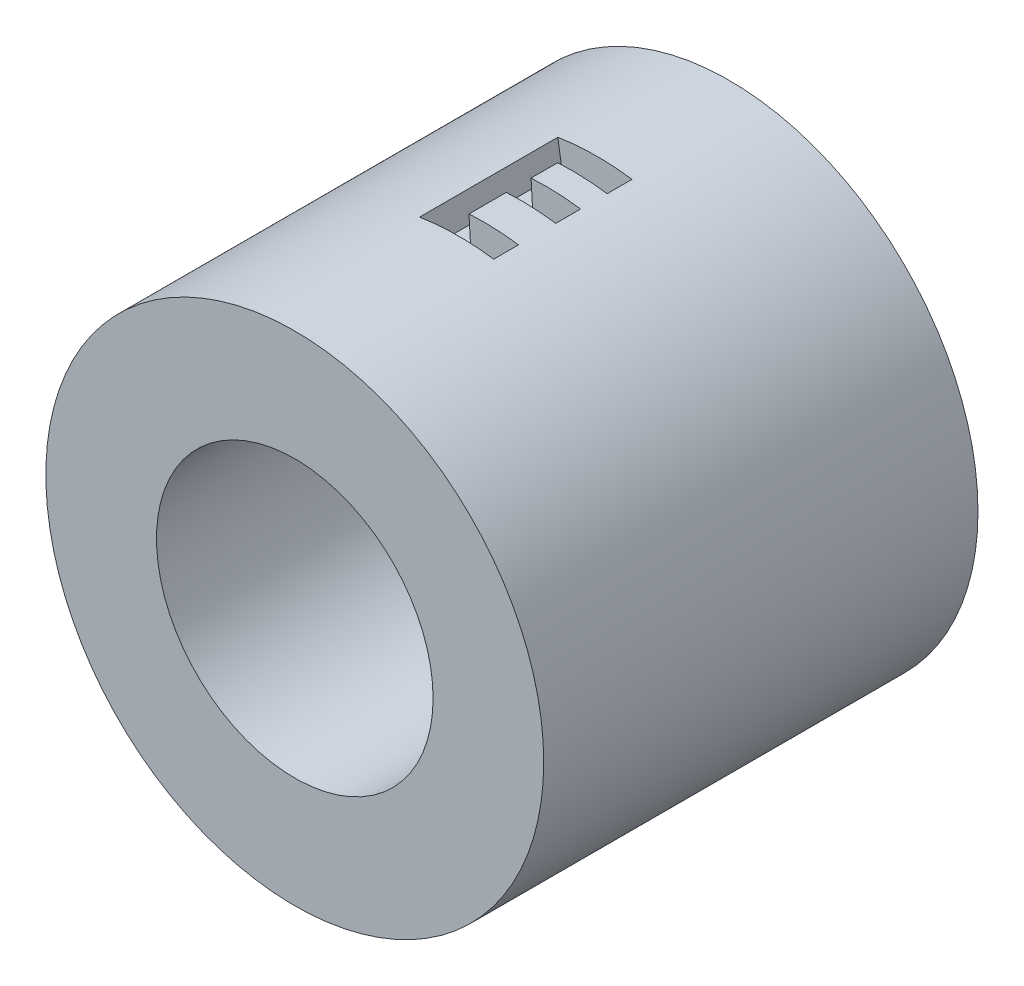
ISO-10303-21;
HEADER;
FILE_DESCRIPTION(('STEP AP214'),'2;1');
FILE_NAME('part.step','',(''),(''),'','','');
FILE_SCHEMA(('AUTOMOTIVE_DESIGN { 1 0 10303 214 1 1 1 1 }'));
ENDSEC;
DATA;
#1=APPLICATION_CONTEXT('core data for automotive mechanical design processes');
#2=APPLICATION_PROTOCOL_DEFINITION('international standard','automotive_design',2000,#1);
#3=PRODUCT_CONTEXT('',#1,'mechanical');
#4=PRODUCT('Part','Part','',(#3));
#5=PRODUCT_RELATED_PRODUCT_CATEGORY('part','',(#4));
#6=PRODUCT_DEFINITION_FORMATION('','',#4);
#7=PRODUCT_DEFINITION_CONTEXT('part definition',#1,'design');
#8=PRODUCT_DEFINITION('design','',#6,#7);
#9=PRODUCT_DEFINITION_SHAPE('','',#8);
#10=(LENGTH_UNIT() NAMED_UNIT(*) SI_UNIT(.MILLI.,.METRE.));
#11=(NAMED_UNIT(*) PLANE_ANGLE_UNIT() SI_UNIT($,.RADIAN.));
#12=(NAMED_UNIT(*) SI_UNIT($,.STERADIAN.) SOLID_ANGLE_UNIT());
#13=UNCERTAINTY_MEASURE_WITH_UNIT(LENGTH_MEASURE(1.E-05),#10,'distance_accuracy_value','');
#14=(GEOMETRIC_REPRESENTATION_CONTEXT(3) GLOBAL_UNCERTAINTY_ASSIGNED_CONTEXT((#13)) GLOBAL_UNIT_ASSIGNED_CONTEXT((#10,
#11,#12)) REPRESENTATION_CONTEXT('',''));
#15=CARTESIAN_POINT('',(0.,0.,0.));
#16=DIRECTION('',(0.,0.,1.));
#17=DIRECTION('',(1.,0.,0.));
#18=AXIS2_PLACEMENT_3D('',#15,#16,#17);
#19=CARTESIAN_POINT('',(0.,0.,19.939));
#20=DIRECTION('',(0.,0.,1.));
#21=DIRECTION('',(1.,0.,0.));
#22=AXIS2_PLACEMENT_3D('',#19,#20,#21);
#23=PLANE('',#22);
#24=CARTESIAN_POINT('',(0.,0.,19.939));
#25=DIRECTION('',(0.,0.,1.));
#26=DIRECTION('',(1.,0.,0.));
#27=AXIS2_PLACEMENT_3D('',#24,#25,#26);
#28=CIRCLE('',#27,11.43);
#29=CARTESIAN_POINT('',(11.43,0.,19.939));
#30=VERTEX_POINT('',#29);
#31=EDGE_CURVE('E13',#30,#30,#28,.T.);
#32=ORIENTED_EDGE('',*,*,#31,.T.);
#33=EDGE_LOOP('',(#32));
#34=FACE_BOUND('',#33,.T.);
#35=CARTESIAN_POINT('',(0.,0.,19.939));
#36=DIRECTION('',(0.,0.,1.));
#37=DIRECTION('',(1.,0.,0.));
#38=AXIS2_PLACEMENT_3D('',#35,#36,#37);
#39=CIRCLE('',#38,6.35);
#40=CARTESIAN_POINT('',(6.35,0.,19.939));
#41=VERTEX_POINT('',#40);
#42=EDGE_CURVE('E278',#41,#41,#39,.T.);
#43=ORIENTED_EDGE('',*,*,#42,.F.);
#44=EDGE_LOOP('',(#43));
#45=FACE_BOUND('',#44,.T.);
#46=ADVANCED_FACE('F85',(#34,#45),#23,.T.);
#47=CARTESIAN_POINT('',(0.,0.,0.));
#48=DIRECTION('',(0.,0.,1.));
#49=DIRECTION('',(1.,0.,0.));
#50=AXIS2_PLACEMENT_3D('',#47,#48,#49);
#51=PLANE('',#50);
#52=CARTESIAN_POINT('',(0.,0.,0.));
#53=DIRECTION('',(0.,0.,1.));
#54=DIRECTION('',(1.,0.,0.));
#55=AXIS2_PLACEMENT_3D('',#52,#53,#54);
#56=CIRCLE('',#55,11.43);
#57=CARTESIAN_POINT('',(11.43,0.,0.));
#58=VERTEX_POINT('',#57);
#59=EDGE_CURVE('E89',#58,#58,#56,.T.);
#60=ORIENTED_EDGE('',*,*,#59,.F.);
#61=EDGE_LOOP('',(#60));
#62=FACE_BOUND('',#61,.T.);
#63=CARTESIAN_POINT('',(0.,0.,0.));
#64=DIRECTION('',(0.,0.,1.));
#65=DIRECTION('',(1.,0.,0.));
#66=AXIS2_PLACEMENT_3D('',#63,#64,#65);
#67=CIRCLE('',#66,6.35);
#68=CARTESIAN_POINT('',(6.35,0.,0.));
#69=VERTEX_POINT('',#68);
#70=EDGE_CURVE('E275',#69,#69,#67,.T.);
#71=ORIENTED_EDGE('',*,*,#70,.T.);
#72=EDGE_LOOP('',(#71));
#73=FACE_BOUND('',#72,.T.);
#74=ADVANCED_FACE('F284',(#62,#73),#51,.F.);
#75=CARTESIAN_POINT('',(0.,0.,19.939));
#76=DIRECTION('',(0.,0.,-1.));
#77=DIRECTION('',(-1.,0.,0.));
#78=AXIS2_PLACEMENT_3D('',#75,#76,#77);
#79=CYLINDRICAL_SURFACE('',#78,11.43);
#80=CARTESIAN_POINT('',(0.,0.,6.05636615340659));
#81=DIRECTION('',(0.,0.,-1.));
#82=DIRECTION('',(0.140015636025612,0.990149292616191,0.));
#83=AXIS2_PLACEMENT_3D('',#80,#81,#82);
#84=CIRCLE('',#83,11.43);
#85=CARTESIAN_POINT('',(-1.80597624031449,11.2864232518287,6.05636615340659));
#86=VERTEX_POINT('',#85);
#87=CARTESIAN_POINT('',(1.60037871977274,11.3174064146031,6.05636615340659));
#88=VERTEX_POINT('',#87);
#89=EDGE_CURVE('E250',#86,#88,#84,.T.);
#90=ORIENTED_EDGE('',*,*,#89,.T.);
#91=DIRECTION('',(0.,0.,1.));
#92=VECTOR('',#91,1.);
#93=CARTESIAN_POINT('',(1.60037871977274,11.3174064146031,6.05636615340659));
#94=LINE('',#93,#92);
#95=CARTESIAN_POINT('',(1.60037871977274,11.3174064146031,7.19610974315018));
#96=VERTEX_POINT('',#95);
#97=EDGE_CURVE('E100',#88,#96,#94,.T.);
#98=ORIENTED_EDGE('',*,*,#97,.T.);
#99=CARTESIAN_POINT('',(0.,0.,7.19610974315018));
#100=DIRECTION('',(0.,0.,-1.));
#101=DIRECTION('',(0.140015636025612,0.990149292616191,0.));
#102=AXIS2_PLACEMENT_3D('',#99,#100,#101);
#103=CIRCLE('',#102,11.43);
#104=CARTESIAN_POINT('',(-0.673442466981699,11.410143524236,7.19610974315018));
#105=VERTEX_POINT('',#104);
#106=EDGE_CURVE('E186',#105,#96,#103,.T.);
#107=ORIENTED_EDGE('',*,*,#106,.F.);
#108=DIRECTION('',(0.,0.,1.));
#109=VECTOR('',#108,1.);
#110=CARTESIAN_POINT('',(-0.673442466981699,11.410143524236,7.19610974315018));
#111=LINE('',#110,#109);
#112=CARTESIAN_POINT('',(-0.673442466981701,11.410143524236,8.41726358930402));
#113=VERTEX_POINT('',#112);
#114=EDGE_CURVE('E242',#105,#113,#111,.T.);
#115=ORIENTED_EDGE('',*,*,#114,.T.);
#116=CARTESIAN_POINT('',(0.,0.,8.41726358930402));
#117=DIRECTION('',(0.,0.,-1.));
#118=DIRECTION('',(0.140015636025611,0.990149292616191,0.));
#119=AXIS2_PLACEMENT_3D('',#116,#117,#118);
#120=CIRCLE('',#119,11.43);
#121=CARTESIAN_POINT('',(1.60037871977274,11.3174064146031,8.41726358930402));
#122=VERTEX_POINT('',#121);
#123=EDGE_CURVE('E238',#113,#122,#120,.T.);
#124=ORIENTED_EDGE('',*,*,#123,.T.);
#125=DIRECTION('',(0.,0.,1.));
#126=VECTOR('',#125,1.);
#127=CARTESIAN_POINT('',(1.60037871977274,11.3174064146031,8.41726358930402));
#128=LINE('',#127,#126);
#129=CARTESIAN_POINT('',(1.60037871977274,11.3174064146031,9.55700717904761));
#130=VERTEX_POINT('',#129);
#131=EDGE_CURVE('E234',#122,#130,#128,.T.);
#132=ORIENTED_EDGE('',*,*,#131,.T.);
#133=CARTESIAN_POINT('',(0.,0.,9.55700717904761));
#134=DIRECTION('',(0.,0.,-1.));
#135=DIRECTION('',(0.140015636025612,0.990149292616191,0.));
#136=AXIS2_PLACEMENT_3D('',#133,#134,#135);
#137=CIRCLE('',#136,11.43);
#138=CARTESIAN_POINT('',(-0.673442466981699,11.410143524236,9.55700717904761));
#139=VERTEX_POINT('',#138);
#140=EDGE_CURVE('E230',#139,#130,#137,.T.);
#141=ORIENTED_EDGE('',*,*,#140,.F.);
#142=DIRECTION('',(0.,0.,1.));
#143=VECTOR('',#142,1.);
#144=CARTESIAN_POINT('',(-0.673442466981699,11.410143524236,9.55700717904761));
#145=LINE('',#144,#143);
#146=CARTESIAN_POINT('',(-0.673442466981701,11.410143524236,11.266622563663));
#147=VERTEX_POINT('',#146);
#148=EDGE_CURVE('E226',#139,#147,#145,.T.);
#149=ORIENTED_EDGE('',*,*,#148,.T.);
#150=CARTESIAN_POINT('',(0.,0.,11.266622563663));
#151=DIRECTION('',(0.,0.,-1.));
#152=DIRECTION('',(0.140015636025611,0.990149292616191,0.));
#153=AXIS2_PLACEMENT_3D('',#150,#151,#152);
#154=CIRCLE('',#153,11.43);
#155=CARTESIAN_POINT('',(1.60037871977274,11.3174064146031,11.266622563663));
#156=VERTEX_POINT('',#155);
#157=EDGE_CURVE('E222',#147,#156,#154,.T.);
#158=ORIENTED_EDGE('',*,*,#157,.T.);
#159=DIRECTION('',(0.,0.,1.));
#160=VECTOR('',#159,1.);
#161=CARTESIAN_POINT('',(1.60037871977274,11.3174064146031,11.266622563663));
#162=LINE('',#161,#160);
#163=CARTESIAN_POINT('',(1.60037871977274,11.3174064146031,12.4063661534066));
#164=VERTEX_POINT('',#163);
#165=EDGE_CURVE('E218',#156,#164,#162,.T.);
#166=ORIENTED_EDGE('',*,*,#165,.T.);
#167=CARTESIAN_POINT('',(0.,0.,12.4063661534066));
#168=DIRECTION('',(0.,0.,-1.));
#169=DIRECTION('',(0.140015636025612,0.990149292616191,0.));
#170=AXIS2_PLACEMENT_3D('',#167,#168,#169);
#171=CIRCLE('',#170,11.43);
#172=CARTESIAN_POINT('',(-1.80597624031449,11.2864232518287,12.4063661534066));
#173=VERTEX_POINT('',#172);
#174=EDGE_CURVE('E214',#173,#164,#171,.T.);
#175=ORIENTED_EDGE('',*,*,#174,.F.);
#176=DIRECTION('',(0.,0.,-1.));
#177=VECTOR('',#176,1.);
#178=CARTESIAN_POINT('',(-1.80597624031449,11.2864232518287,12.4063661534066));
#179=LINE('',#178,#177);
#180=EDGE_CURVE('E254',#173,#86,#179,.T.);
#181=ORIENTED_EDGE('',*,*,#180,.T.);
#182=EDGE_LOOP('',(#90,#98,#107,#115,#124,#132,#141,#149,#158,#166,#175,#181));
#183=FACE_BOUND('',#182,.T.);
#184=ORIENTED_EDGE('',*,*,#31,.F.);
#185=EDGE_LOOP('',(#184));
#186=FACE_BOUND('',#185,.T.);
#187=ORIENTED_EDGE('',*,*,#59,.T.);
#188=EDGE_LOOP('',(#187));
#189=FACE_BOUND('',#188,.T.);
#190=ADVANCED_FACE('F87',(#183,#186,#189),#79,.T.);
#191=CARTESIAN_POINT('',(0.,0.,19.939));
#192=DIRECTION('',(0.,0.,-1.));
#193=DIRECTION('',(-1.,0.,0.));
#194=AXIS2_PLACEMENT_3D('',#191,#192,#193);
#195=CYLINDRICAL_SURFACE('',#194,6.35);
#196=ORIENTED_EDGE('',*,*,#42,.T.);
#197=EDGE_LOOP('',(#196));
#198=FACE_BOUND('',#197,.T.);
#199=ORIENTED_EDGE('',*,*,#70,.F.);
#200=EDGE_LOOP('',(#199));
#201=FACE_BOUND('',#200,.T.);
#202=ADVANCED_FACE('F286',(#198,#201),#195,.F.);
#203=CARTESIAN_POINT('',(1.60037871977274,11.3174064146031,6.62623794827838));
#204=DIRECTION('',(-0.990149292616191,0.140015636025612,0.));
#205=DIRECTION('',(0.,0.,1.));
#206=AXIS2_PLACEMENT_3D('',#203,#204,#205);
#207=PLANE('',#206);
#208=DIRECTION('',(-0.140015636025612,-0.990149292616191,0.));
#209=VECTOR('',#208,1.);
#210=CARTESIAN_POINT('',(1.60037871977274,11.3174064146031,6.05636615340659));
#211=LINE('',#210,#209);
#212=CARTESIAN_POINT('',(1.42255886202022,10.0599168129805,6.05636615340659));
#213=VERTEX_POINT('',#212);
#214=EDGE_CURVE('E187',#88,#213,#211,.T.);
#215=ORIENTED_EDGE('',*,*,#214,.T.);
#216=DIRECTION('',(0.,0.,-1.));
#217=VECTOR('',#216,1.);
#218=CARTESIAN_POINT('',(1.42255886202022,10.0599168129805,19.939));
#219=LINE('',#218,#217);
#220=CARTESIAN_POINT('',(1.42255886202022,10.0599168129805,7.19610974315018));
#221=VERTEX_POINT('',#220);
#222=EDGE_CURVE('E191',#213,#221,#219,.F.);
#223=ORIENTED_EDGE('',*,*,#222,.T.);
#224=DIRECTION('',(-0.140015636025612,-0.990149292616191,0.));
#225=VECTOR('',#224,1.);
#226=CARTESIAN_POINT('',(1.60037871977274,11.3174064146031,7.19610974315018));
#227=LINE('',#226,#225);
#228=EDGE_CURVE('E179',#96,#221,#227,.T.);
#229=ORIENTED_EDGE('',*,*,#228,.F.);
#230=ORIENTED_EDGE('',*,*,#97,.F.);
#231=EDGE_LOOP('',(#215,#223,#229,#230));
#232=FACE_BOUND('',#231,.T.);
#233=ADVANCED_FACE('F192',(#232),#207,.T.);
#234=CARTESIAN_POINT('',(0.,0.,7.19610974315018));
#235=DIRECTION('',(0.,0.,1.));
#236=DIRECTION('',(1.,0.,0.));
#237=AXIS2_PLACEMENT_3D('',#234,#235,#236);
#238=PLANE('',#237);
#239=ORIENTED_EDGE('',*,*,#228,.T.);
#240=CARTESIAN_POINT('',(0.,0.,7.19610974315018));
#241=DIRECTION('',(0.,0.,-1.));
#242=DIRECTION('',(-1.,0.,0.));
#243=AXIS2_PLACEMENT_3D('',#240,#241,#242);
#244=CIRCLE('',#243,10.16);
#245=CARTESIAN_POINT('',(-0.598615526205954,10.1423497993209,7.19610974315018));
#246=VERTEX_POINT('',#245);
#247=EDGE_CURVE('E183',#246,#221,#244,.T.);
#248=ORIENTED_EDGE('',*,*,#247,.F.);
#249=DIRECTION('',(0.0589188510045231,-0.998262775523713,0.));
#250=VECTOR('',#249,1.);
#251=CARTESIAN_POINT('',(-0.673442466981699,11.410143524236,7.19610974315018));
#252=LINE('',#251,#250);
#253=EDGE_CURVE('E188',#105,#246,#252,.T.);
#254=ORIENTED_EDGE('',*,*,#253,.F.);
#255=ORIENTED_EDGE('',*,*,#106,.T.);
#256=EDGE_LOOP('',(#239,#248,#254,#255));
#257=FACE_BOUND('',#256,.T.);
#258=ADVANCED_FACE('F181',(#257),#238,.F.);
#259=CARTESIAN_POINT('',(-0.673442466981699,11.410143524236,7.8066866662271));
#260=DIRECTION('',(-0.998262775523713,-0.0589188510045231,0.));
#261=DIRECTION('',(0.,0.,1.));
#262=AXIS2_PLACEMENT_3D('',#259,#260,#261);
#263=PLANE('',#262);
#264=ORIENTED_EDGE('',*,*,#253,.T.);
#265=DIRECTION('',(0.,0.,-1.));
#266=VECTOR('',#265,1.);
#267=CARTESIAN_POINT('',(-0.598615526205954,10.1423497993209,19.939));
#268=LINE('',#267,#266);
#269=CARTESIAN_POINT('',(-0.598615526205954,10.1423497993209,8.41726358930402));
#270=VERTEX_POINT('',#269);
#271=EDGE_CURVE('E201',#246,#270,#268,.F.);
#272=ORIENTED_EDGE('',*,*,#271,.T.);
#273=DIRECTION('',(0.0589188510045233,-0.998262775523713,0.));
#274=VECTOR('',#273,1.);
#275=CARTESIAN_POINT('',(-0.673442466981701,11.410143524236,8.41726358930402));
#276=LINE('',#275,#274);
#277=EDGE_CURVE('E271',#113,#270,#276,.T.);
#278=ORIENTED_EDGE('',*,*,#277,.F.);
#279=ORIENTED_EDGE('',*,*,#114,.F.);
#280=EDGE_LOOP('',(#264,#272,#278,#279));
#281=FACE_BOUND('',#280,.T.);
#282=ADVANCED_FACE('F334',(#281),#263,.T.);
#283=CARTESIAN_POINT('',(0.,0.,8.41726358930402));
#284=DIRECTION('',(0.,0.,1.));
#285=DIRECTION('',(1.,0.,0.));
#286=AXIS2_PLACEMENT_3D('',#283,#284,#285);
#287=PLANE('',#286);
#288=ORIENTED_EDGE('',*,*,#277,.T.);
#289=CARTESIAN_POINT('',(0.,0.,8.41726358930402));
#290=DIRECTION('',(0.,0.,-1.));
#291=DIRECTION('',(-1.,0.,0.));
#292=AXIS2_PLACEMENT_3D('',#289,#290,#291);
#293=CIRCLE('',#292,10.16);
#294=CARTESIAN_POINT('',(1.42255886202022,10.0599168129805,8.41726358930402));
#295=VERTEX_POINT('',#294);
#296=EDGE_CURVE('E207',#270,#295,#293,.T.);
#297=ORIENTED_EDGE('',*,*,#296,.T.);
#298=DIRECTION('',(-0.140015636025612,-0.990149292616191,0.));
#299=VECTOR('',#298,1.);
#300=CARTESIAN_POINT('',(1.60037871977274,11.3174064146031,8.41726358930402));
#301=LINE('',#300,#299);
#302=EDGE_CURVE('E269',#122,#295,#301,.T.);
#303=ORIENTED_EDGE('',*,*,#302,.F.);
#304=ORIENTED_EDGE('',*,*,#123,.F.);
#305=EDGE_LOOP('',(#288,#297,#303,#304));
#306=FACE_BOUND('',#305,.T.);
#307=ADVANCED_FACE('F343',(#306),#287,.T.);
#308=CARTESIAN_POINT('',(1.60037871977274,11.3174064146031,8.98713538417582));
#309=DIRECTION('',(-0.990149292616191,0.140015636025612,0.));
#310=DIRECTION('',(0.,0.,1.));
#311=AXIS2_PLACEMENT_3D('',#308,#309,#310);
#312=PLANE('',#311);
#313=ORIENTED_EDGE('',*,*,#302,.T.);
#314=DIRECTION('',(0.,0.,-1.));
#315=VECTOR('',#314,1.);
#316=CARTESIAN_POINT('',(1.42255886202022,10.0599168129805,19.939));
#317=LINE('',#316,#315);
#318=CARTESIAN_POINT('',(1.42255886202022,10.0599168129805,9.55700717904761));
#319=VERTEX_POINT('',#318);
#320=EDGE_CURVE('E469',#295,#319,#317,.F.);
#321=ORIENTED_EDGE('',*,*,#320,.T.);
#322=DIRECTION('',(-0.140015636025612,-0.990149292616191,0.));
#323=VECTOR('',#322,1.);
#324=CARTESIAN_POINT('',(1.60037871977274,11.3174064146031,9.55700717904761));
#325=LINE('',#324,#323);
#326=EDGE_CURVE('E267',#130,#319,#325,.T.);
#327=ORIENTED_EDGE('',*,*,#326,.F.);
#328=ORIENTED_EDGE('',*,*,#131,.F.);
#329=EDGE_LOOP('',(#313,#321,#327,#328));
#330=FACE_BOUND('',#329,.T.);
#331=ADVANCED_FACE('F353',(#330),#312,.T.);
#332=CARTESIAN_POINT('',(0.,0.,9.55700717904761));
#333=DIRECTION('',(0.,0.,1.));
#334=DIRECTION('',(1.,0.,0.));
#335=AXIS2_PLACEMENT_3D('',#332,#333,#334);
#336=PLANE('',#335);
#337=ORIENTED_EDGE('',*,*,#326,.T.);
#338=CARTESIAN_POINT('',(0.,0.,9.55700717904761));
#339=DIRECTION('',(0.,0.,-1.));
#340=DIRECTION('',(-1.,0.,0.));
#341=AXIS2_PLACEMENT_3D('',#338,#339,#340);
#342=CIRCLE('',#341,10.16);
#343=CARTESIAN_POINT('',(-0.598615526205954,10.1423497993209,9.55700717904761));
#344=VERTEX_POINT('',#343);
#345=EDGE_CURVE('E465',#344,#319,#342,.T.);
#346=ORIENTED_EDGE('',*,*,#345,.F.);
#347=DIRECTION('',(0.0589188510045231,-0.998262775523713,0.));
#348=VECTOR('',#347,1.);
#349=CARTESIAN_POINT('',(-0.673442466981699,11.410143524236,9.55700717904761));
#350=LINE('',#349,#348);
#351=EDGE_CURVE('E265',#139,#344,#350,.T.);
#352=ORIENTED_EDGE('',*,*,#351,.F.);
#353=ORIENTED_EDGE('',*,*,#140,.T.);
#354=EDGE_LOOP('',(#337,#346,#352,#353));
#355=FACE_BOUND('',#354,.T.);
#356=ADVANCED_FACE('F363',(#355),#336,.F.);
#357=CARTESIAN_POINT('',(-0.673442466981699,11.410143524236,10.4118148713553));
#358=DIRECTION('',(-0.998262775523713,-0.0589188510045231,0.));
#359=DIRECTION('',(0.,0.,1.));
#360=AXIS2_PLACEMENT_3D('',#357,#358,#359);
#361=PLANE('',#360);
#362=ORIENTED_EDGE('',*,*,#351,.T.);
#363=DIRECTION('',(0.,0.,-1.));
#364=VECTOR('',#363,1.);
#365=CARTESIAN_POINT('',(-0.598615526205954,10.1423497993209,19.939));
#366=LINE('',#365,#364);
#367=CARTESIAN_POINT('',(-0.598615526205954,10.1423497993209,11.266622563663));
#368=VERTEX_POINT('',#367);
#369=EDGE_CURVE('E461',#344,#368,#366,.F.);
#370=ORIENTED_EDGE('',*,*,#369,.T.);
#371=DIRECTION('',(0.0589188510045233,-0.998262775523713,0.));
#372=VECTOR('',#371,1.);
#373=CARTESIAN_POINT('',(-0.673442466981701,11.410143524236,11.266622563663));
#374=LINE('',#373,#372);
#375=EDGE_CURVE('E263',#147,#368,#374,.T.);
#376=ORIENTED_EDGE('',*,*,#375,.F.);
#377=ORIENTED_EDGE('',*,*,#148,.F.);
#378=EDGE_LOOP('',(#362,#370,#376,#377));
#379=FACE_BOUND('',#378,.T.);
#380=ADVANCED_FACE('F373',(#379),#361,.T.);
#381=CARTESIAN_POINT('',(0.,0.,11.266622563663));
#382=DIRECTION('',(0.,0.,1.));
#383=DIRECTION('',(1.,0.,0.));
#384=AXIS2_PLACEMENT_3D('',#381,#382,#383);
#385=PLANE('',#384);
#386=ORIENTED_EDGE('',*,*,#375,.T.);
#387=CARTESIAN_POINT('',(0.,0.,11.266622563663));
#388=DIRECTION('',(0.,0.,-1.));
#389=DIRECTION('',(-1.,0.,0.));
#390=AXIS2_PLACEMENT_3D('',#387,#388,#389);
#391=CIRCLE('',#390,10.16);
#392=CARTESIAN_POINT('',(1.42255886202022,10.0599168129805,11.266622563663));
#393=VERTEX_POINT('',#392);
#394=EDGE_CURVE('E454',#368,#393,#391,.T.);
#395=ORIENTED_EDGE('',*,*,#394,.T.);
#396=DIRECTION('',(-0.140015636025612,-0.990149292616191,0.));
#397=VECTOR('',#396,1.);
#398=CARTESIAN_POINT('',(1.60037871977274,11.3174064146031,11.266622563663));
#399=LINE('',#398,#397);
#400=EDGE_CURVE('E261',#156,#393,#399,.T.);
#401=ORIENTED_EDGE('',*,*,#400,.F.);
#402=ORIENTED_EDGE('',*,*,#157,.F.);
#403=EDGE_LOOP('',(#386,#395,#401,#402));
#404=FACE_BOUND('',#403,.T.);
#405=ADVANCED_FACE('F383',(#404),#385,.T.);
#406=CARTESIAN_POINT('',(1.60037871977274,11.3174064146031,11.8364943585348));
#407=DIRECTION('',(-0.990149292616191,0.140015636025612,0.));
#408=DIRECTION('',(0.,0.,1.));
#409=AXIS2_PLACEMENT_3D('',#406,#407,#408);
#410=PLANE('',#409);
#411=ORIENTED_EDGE('',*,*,#400,.T.);
#412=DIRECTION('',(0.,0.,-1.));
#413=VECTOR('',#412,1.);
#414=CARTESIAN_POINT('',(1.42255886202022,10.0599168129805,19.939));
#415=LINE('',#414,#413);
#416=CARTESIAN_POINT('',(1.42255886202022,10.0599168129805,12.4063661534066));
#417=VERTEX_POINT('',#416);
#418=EDGE_CURVE('E449',#393,#417,#415,.F.);
#419=ORIENTED_EDGE('',*,*,#418,.T.);
#420=DIRECTION('',(-0.140015636025612,-0.990149292616191,0.));
#421=VECTOR('',#420,1.);
#422=CARTESIAN_POINT('',(1.60037871977274,11.3174064146031,12.4063661534066));
#423=LINE('',#422,#421);
#424=EDGE_CURVE('E259',#164,#417,#423,.T.);
#425=ORIENTED_EDGE('',*,*,#424,.F.);
#426=ORIENTED_EDGE('',*,*,#165,.F.);
#427=EDGE_LOOP('',(#411,#419,#425,#426));
#428=FACE_BOUND('',#427,.T.);
#429=ADVANCED_FACE('F393',(#428),#410,.T.);
#430=CARTESIAN_POINT('',(0.,0.,12.4063661534066));
#431=DIRECTION('',(0.,0.,1.));
#432=DIRECTION('',(1.,0.,0.));
#433=AXIS2_PLACEMENT_3D('',#430,#431,#432);
#434=PLANE('',#433);
#435=ORIENTED_EDGE('',*,*,#424,.T.);
#436=CARTESIAN_POINT('',(0.,0.,12.4063661534066));
#437=DIRECTION('',(0.,0.,-1.));
#438=DIRECTION('',(-1.,0.,0.));
#439=AXIS2_PLACEMENT_3D('',#436,#437,#438);
#440=CIRCLE('',#439,10.16);
#441=CARTESIAN_POINT('',(-1.60531221361288,10.0323762238477,12.4063661534066));
#442=VERTEX_POINT('',#441);
#443=EDGE_CURVE('E277',#442,#417,#440,.T.);
#444=ORIENTED_EDGE('',*,*,#443,.F.);
#445=DIRECTION('',(0.158003170631189,-0.987438604709423,0.));
#446=VECTOR('',#445,1.);
#447=CARTESIAN_POINT('',(-1.80597624031449,11.2864232518287,12.4063661534066));
#448=LINE('',#447,#446);
#449=EDGE_CURVE('E150',#173,#442,#448,.T.);
#450=ORIENTED_EDGE('',*,*,#449,.F.);
#451=ORIENTED_EDGE('',*,*,#174,.T.);
#452=EDGE_LOOP('',(#435,#444,#450,#451));
#453=FACE_BOUND('',#452,.T.);
#454=ADVANCED_FACE('F403',(#453),#434,.F.);
#455=CARTESIAN_POINT('',(-1.80597624031449,11.2864232518287,9.23136615340659));
#456=DIRECTION('',(0.987438604709422,0.158003170631189,0.));
#457=DIRECTION('',(0.,0.,-1.));
#458=AXIS2_PLACEMENT_3D('',#455,#456,#457);
#459=PLANE('',#458);
#460=ORIENTED_EDGE('',*,*,#449,.T.);
#461=DIRECTION('',(0.,0.,-1.));
#462=VECTOR('',#461,1.);
#463=CARTESIAN_POINT('',(-1.60531221361288,10.0323762238477,19.939));
#464=LINE('',#463,#462);
#465=CARTESIAN_POINT('',(-1.60531221361288,10.0323762238477,6.05636615340659));
#466=VERTEX_POINT('',#465);
#467=EDGE_CURVE('E213',#442,#466,#464,.T.);
#468=ORIENTED_EDGE('',*,*,#467,.T.);
#469=DIRECTION('',(0.158003170631189,-0.987438604709423,0.));
#470=VECTOR('',#469,1.);
#471=CARTESIAN_POINT('',(-1.80597624031449,11.2864232518287,6.05636615340659));
#472=LINE('',#471,#470);
#473=EDGE_CURVE('E109',#86,#466,#472,.T.);
#474=ORIENTED_EDGE('',*,*,#473,.F.);
#475=ORIENTED_EDGE('',*,*,#180,.F.);
#476=EDGE_LOOP('',(#460,#468,#474,#475));
#477=FACE_BOUND('',#476,.T.);
#478=ADVANCED_FACE('F413',(#477),#459,.T.);
#479=CARTESIAN_POINT('',(0.,0.,6.05636615340659));
#480=DIRECTION('',(0.,0.,1.));
#481=DIRECTION('',(1.,0.,0.));
#482=AXIS2_PLACEMENT_3D('',#479,#480,#481);
#483=PLANE('',#482);
#484=ORIENTED_EDGE('',*,*,#89,.F.);
#485=ORIENTED_EDGE('',*,*,#473,.T.);
#486=CARTESIAN_POINT('',(0.,0.,6.05636615340659));
#487=DIRECTION('',(0.,0.,-1.));
#488=DIRECTION('',(-1.,0.,0.));
#489=AXIS2_PLACEMENT_3D('',#486,#487,#488);
#490=CIRCLE('',#489,10.16);
#491=EDGE_CURVE('E196',#466,#213,#490,.T.);
#492=ORIENTED_EDGE('',*,*,#491,.T.);
#493=ORIENTED_EDGE('',*,*,#214,.F.);
#494=EDGE_LOOP('',(#484,#485,#492,#493));
#495=FACE_BOUND('',#494,.T.);
#496=ADVANCED_FACE('F423',(#495),#483,.T.);
#497=CARTESIAN_POINT('',(0.,0.,19.939));
#498=DIRECTION('',(0.,0.,-1.));
#499=DIRECTION('',(-1.,0.,0.));
#500=AXIS2_PLACEMENT_3D('',#497,#498,#499);
#501=CYLINDRICAL_SURFACE('',#500,10.16);
#502=ORIENTED_EDGE('',*,*,#467,.F.);
#503=ORIENTED_EDGE('',*,*,#443,.T.);
#504=ORIENTED_EDGE('',*,*,#418,.F.);
#505=ORIENTED_EDGE('',*,*,#394,.F.);
#506=ORIENTED_EDGE('',*,*,#369,.F.);
#507=ORIENTED_EDGE('',*,*,#345,.T.);
#508=ORIENTED_EDGE('',*,*,#320,.F.);
#509=ORIENTED_EDGE('',*,*,#296,.F.);
#510=ORIENTED_EDGE('',*,*,#271,.F.);
#511=ORIENTED_EDGE('',*,*,#247,.T.);
#512=ORIENTED_EDGE('',*,*,#222,.F.);
#513=ORIENTED_EDGE('',*,*,#491,.F.);
#514=EDGE_LOOP('',(#502,#503,#504,#505,#506,#507,#508,#509,#510,#511,#512,#513));
#515=FACE_BOUND('',#514,.T.);
#516=ADVANCED_FACE('F198',(#515),#501,.T.);
#517=CLOSED_SHELL('',(#46,#74,#190,#202,#233,#258,#282,#307,#331,#356,#380,#405,#429,#454,#478,
#496,#516));
#518=MANIFOLD_SOLID_BREP('B2',#517);
#519=ADVANCED_BREP_SHAPE_REPRESENTATION('',(#18,#518),#14);
#520=SHAPE_DEFINITION_REPRESENTATION(#9,#519);
ENDSEC;
END-ISO-10303-21;
